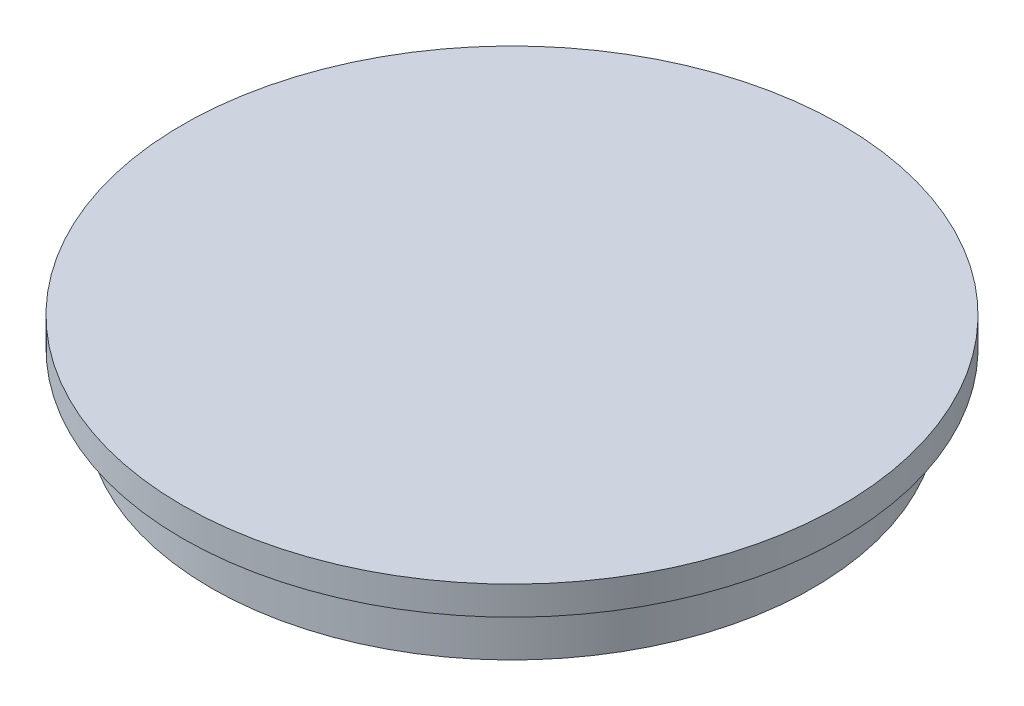
ISO-10303-21;
HEADER;
FILE_DESCRIPTION(('STEP AP214'),'2;1');
FILE_NAME('part.step','',(''),(''),'','','');
FILE_SCHEMA(('AUTOMOTIVE_DESIGN { 1 0 10303 214 1 1 1 1 }'));
ENDSEC;
DATA;
#1=APPLICATION_CONTEXT('core data for automotive mechanical design processes');
#2=APPLICATION_PROTOCOL_DEFINITION('international standard','automotive_design',2000,#1);
#3=PRODUCT_CONTEXT('',#1,'mechanical');
#4=PRODUCT('Part','Part','',(#3));
#5=PRODUCT_RELATED_PRODUCT_CATEGORY('part','',(#4));
#6=PRODUCT_DEFINITION_FORMATION('','',#4);
#7=PRODUCT_DEFINITION_CONTEXT('part definition',#1,'design');
#8=PRODUCT_DEFINITION('design','',#6,#7);
#9=PRODUCT_DEFINITION_SHAPE('','',#8);
#10=(LENGTH_UNIT() NAMED_UNIT(*) SI_UNIT(.MILLI.,.METRE.));
#11=(NAMED_UNIT(*) PLANE_ANGLE_UNIT() SI_UNIT($,.RADIAN.));
#12=(NAMED_UNIT(*) SI_UNIT($,.STERADIAN.) SOLID_ANGLE_UNIT());
#13=UNCERTAINTY_MEASURE_WITH_UNIT(LENGTH_MEASURE(1.E-05),#10,'distance_accuracy_value','');
#14=(GEOMETRIC_REPRESENTATION_CONTEXT(3) GLOBAL_UNCERTAINTY_ASSIGNED_CONTEXT((#13)) GLOBAL_UNIT_ASSIGNED_CONTEXT((#10,
#11,#12)) REPRESENTATION_CONTEXT('',''));
#15=CARTESIAN_POINT('',(0.,0.,0.));
#16=DIRECTION('',(0.,0.,1.));
#17=DIRECTION('',(1.,0.,0.));
#18=AXIS2_PLACEMENT_3D('',#15,#16,#17);
#19=CARTESIAN_POINT('',(0.,2.54,0.));
#20=DIRECTION('',(0.,-1.,0.));
#21=DIRECTION('',(0.,0.,-1.));
#22=AXIS2_PLACEMENT_3D('',#19,#20,#21);
#23=CYLINDRICAL_SURFACE('',#22,29.21);
#24=CARTESIAN_POINT('',(0.,2.54,0.));
#25=DIRECTION('',(0.,1.,0.));
#26=DIRECTION('',(0.,0.,1.));
#27=AXIS2_PLACEMENT_3D('',#24,#25,#26);
#28=CIRCLE('',#27,29.21);
#29=CARTESIAN_POINT('',(0.,2.54,29.21));
#30=VERTEX_POINT('',#29);
#31=EDGE_CURVE('E44',#30,#30,#28,.T.);
#32=ORIENTED_EDGE('',*,*,#31,.F.);
#33=EDGE_LOOP('',(#32));
#34=FACE_BOUND('',#33,.T.);
#35=CARTESIAN_POINT('',(0.,0.,0.));
#36=DIRECTION('',(0.,1.,0.));
#37=DIRECTION('',(0.,0.,1.));
#38=AXIS2_PLACEMENT_3D('',#35,#36,#37);
#39=CIRCLE('',#38,29.21);
#40=CARTESIAN_POINT('',(0.,0.,29.21));
#41=VERTEX_POINT('',#40);
#42=EDGE_CURVE('E49',#41,#41,#39,.T.);
#43=ORIENTED_EDGE('',*,*,#42,.T.);
#44=EDGE_LOOP('',(#43));
#45=FACE_BOUND('',#44,.T.);
#46=ADVANCED_FACE('F37',(#34,#45),#23,.T.);
#47=CARTESIAN_POINT('',(0.,2.54,0.));
#48=DIRECTION('',(0.,1.,0.));
#49=DIRECTION('',(0.,0.,1.));
#50=AXIS2_PLACEMENT_3D('',#47,#48,#49);
#51=PLANE('',#50);
#52=ORIENTED_EDGE('',*,*,#31,.T.);
#53=EDGE_LOOP('',(#52));
#54=FACE_BOUND('',#53,.T.);
#55=ADVANCED_FACE('F84',(#54),#51,.T.);
#56=CARTESIAN_POINT('',(0.,0.,0.));
#57=DIRECTION('',(0.,1.,0.));
#58=DIRECTION('',(0.,0.,1.));
#59=AXIS2_PLACEMENT_3D('',#56,#57,#58);
#60=PLANE('',#59);
#61=CARTESIAN_POINT('',(0.,0.,0.));
#62=DIRECTION('',(0.,1.,0.));
#63=DIRECTION('',(0.,0.,1.));
#64=AXIS2_PLACEMENT_3D('',#61,#62,#63);
#65=CIRCLE('',#64,26.67);
#66=CARTESIAN_POINT('',(0.,0.,26.67));
#67=VERTEX_POINT('',#66);
#68=EDGE_CURVE('E10',#67,#67,#65,.F.);
#69=ORIENTED_EDGE('',*,*,#68,.F.);
#70=EDGE_LOOP('',(#69));
#71=FACE_BOUND('',#70,.T.);
#72=ORIENTED_EDGE('',*,*,#42,.F.);
#73=EDGE_LOOP('',(#72));
#74=FACE_BOUND('',#73,.T.);
#75=ADVANCED_FACE('F75',(#71,#74),#60,.F.);
#76=CARTESIAN_POINT('',(0.,-5.08,0.));
#77=DIRECTION('',(0.,-1.,0.));
#78=DIRECTION('',(0.,0.,-1.));
#79=AXIS2_PLACEMENT_3D('',#76,#77,#78);
#80=PLANE('',#79);
#81=CARTESIAN_POINT('',(0.,-5.08,0.));
#82=DIRECTION('',(0.,-1.,0.));
#83=DIRECTION('',(0.,0.,-1.));
#84=AXIS2_PLACEMENT_3D('',#81,#82,#83);
#85=CIRCLE('',#84,26.67);
#86=CARTESIAN_POINT('',(0.,-5.08,-26.67));
#87=VERTEX_POINT('',#86);
#88=EDGE_CURVE('E55',#87,#87,#85,.T.);
#89=ORIENTED_EDGE('',*,*,#88,.T.);
#90=EDGE_LOOP('',(#89));
#91=FACE_BOUND('',#90,.T.);
#92=CARTESIAN_POINT('',(0.,-5.08,0.));
#93=DIRECTION('',(0.,-1.,0.));
#94=DIRECTION('',(0.,0.,-1.));
#95=AXIS2_PLACEMENT_3D('',#92,#93,#94);
#96=CIRCLE('',#95,22.86);
#97=CARTESIAN_POINT('',(0.,-5.08,-22.86));
#98=VERTEX_POINT('',#97);
#99=EDGE_CURVE('E60',#98,#98,#96,.T.);
#100=ORIENTED_EDGE('',*,*,#99,.F.);
#101=EDGE_LOOP('',(#100));
#102=FACE_BOUND('',#101,.T.);
#103=ADVANCED_FACE('F72',(#91,#102),#80,.T.);
#104=CARTESIAN_POINT('',(0.,-5.08,0.));
#105=DIRECTION('',(0.,1.,0.));
#106=DIRECTION('',(0.,0.,1.));
#107=AXIS2_PLACEMENT_3D('',#104,#105,#106);
#108=CYLINDRICAL_SURFACE('',#107,26.67);
#109=ORIENTED_EDGE('',*,*,#88,.F.);
#110=EDGE_LOOP('',(#109));
#111=FACE_BOUND('',#110,.T.);
#112=ORIENTED_EDGE('',*,*,#68,.T.);
#113=EDGE_LOOP('',(#112));
#114=FACE_BOUND('',#113,.T.);
#115=ADVANCED_FACE('F74',(#111,#114),#108,.T.);
#116=CARTESIAN_POINT('',(0.,-5.08,0.));
#117=DIRECTION('',(0.,1.,0.));
#118=DIRECTION('',(0.,0.,1.));
#119=AXIS2_PLACEMENT_3D('',#116,#117,#118);
#120=CYLINDRICAL_SURFACE('',#119,22.86);
#121=ORIENTED_EDGE('',*,*,#99,.T.);
#122=EDGE_LOOP('',(#121));
#123=FACE_BOUND('',#122,.T.);
#124=CARTESIAN_POINT('',(0.,0.,0.));
#125=DIRECTION('',(0.,-1.,0.));
#126=DIRECTION('',(0.,0.,-1.));
#127=AXIS2_PLACEMENT_3D('',#124,#125,#126);
#128=CIRCLE('',#127,22.86);
#129=CARTESIAN_POINT('',(0.,0.,-22.86));
#130=VERTEX_POINT('',#129);
#131=EDGE_CURVE('E61',#130,#130,#128,.T.);
#132=ORIENTED_EDGE('',*,*,#131,.F.);
#133=EDGE_LOOP('',(#132));
#134=FACE_BOUND('',#133,.T.);
#135=ADVANCED_FACE('F69',(#123,#134),#120,.F.);
#136=ORIENTED_EDGE('',*,*,#131,.T.);
#137=EDGE_LOOP('',(#136));
#138=FACE_BOUND('',#137,.T.);
#139=ADVANCED_FACE('F86',(#138),#60,.F.);
#140=CLOSED_SHELL('',(#46,#55,#75,#103,#115,#135,#139));
#141=MANIFOLD_SOLID_BREP('B2',#140);
#142=ADVANCED_BREP_SHAPE_REPRESENTATION('',(#18,#141),#14);
#143=SHAPE_DEFINITION_REPRESENTATION(#9,#142);
ENDSEC;
END-ISO-10303-21;
